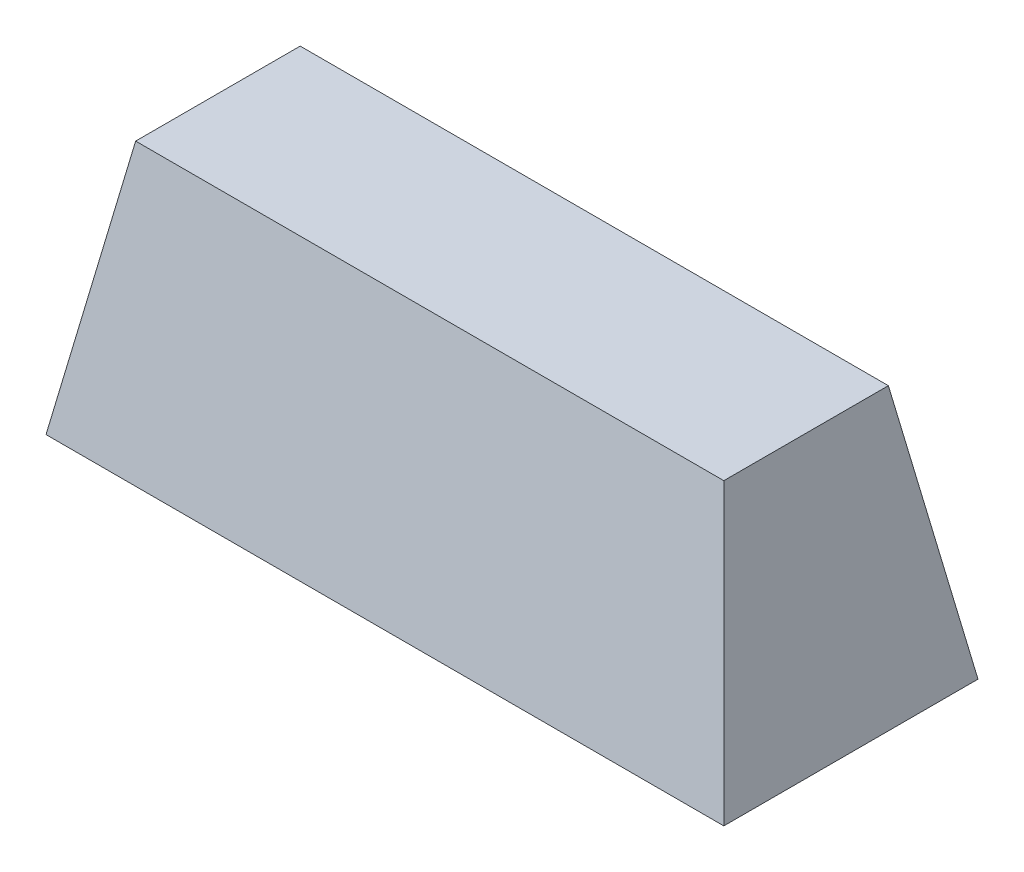
ISO-10303-21;
HEADER;
FILE_DESCRIPTION(('STEP AP214'),'2;1');
FILE_NAME('part.step','',(''),(''),'','','');
FILE_SCHEMA(('AUTOMOTIVE_DESIGN { 1 0 10303 214 1 1 1 1 }'));
ENDSEC;
DATA;
#1=APPLICATION_CONTEXT('core data for automotive mechanical design processes');
#2=APPLICATION_PROTOCOL_DEFINITION('international standard','automotive_design',2000,#1);
#3=PRODUCT_CONTEXT('',#1,'mechanical');
#4=PRODUCT('Part','Part','',(#3));
#5=PRODUCT_RELATED_PRODUCT_CATEGORY('part','',(#4));
#6=PRODUCT_DEFINITION_FORMATION('','',#4);
#7=PRODUCT_DEFINITION_CONTEXT('part definition',#1,'design');
#8=PRODUCT_DEFINITION('design','',#6,#7);
#9=PRODUCT_DEFINITION_SHAPE('','',#8);
#10=(LENGTH_UNIT() NAMED_UNIT(*) SI_UNIT(.MILLI.,.METRE.));
#11=(NAMED_UNIT(*) PLANE_ANGLE_UNIT() SI_UNIT($,.RADIAN.));
#12=(NAMED_UNIT(*) SI_UNIT($,.STERADIAN.) SOLID_ANGLE_UNIT());
#13=UNCERTAINTY_MEASURE_WITH_UNIT(LENGTH_MEASURE(1.E-05),#10,'distance_accuracy_value','');
#14=(GEOMETRIC_REPRESENTATION_CONTEXT(3) GLOBAL_UNCERTAINTY_ASSIGNED_CONTEXT((#13)) GLOBAL_UNIT_ASSIGNED_CONTEXT((#10,
#11,#12)) REPRESENTATION_CONTEXT('',''));
#15=CARTESIAN_POINT('',(0.,0.,0.));
#16=DIRECTION('',(0.,0.,1.));
#17=DIRECTION('',(1.,0.,0.));
#18=AXIS2_PLACEMENT_3D('',#15,#16,#17);
#19=CARTESIAN_POINT('',(-100.,0.,-37.5));
#20=DIRECTION('',(-0.984807753012208,0.17364817766693,0.));
#21=DIRECTION('',(-0.17364817766693,-0.984807753012208,0.));
#22=AXIS2_PLACEMENT_3D('',#19,#20,#21);
#23=PLANE('',#22);
#24=DIRECTION('',(0.,0.,1.));
#25=VECTOR('',#24,1.);
#26=CARTESIAN_POINT('',(-100.,0.,-37.5));
#27=LINE('',#26,#25);
#28=CARTESIAN_POINT('',(-100.,0.,-37.5));
#29=VERTEX_POINT('',#28);
#30=CARTESIAN_POINT('',(-100.,0.,37.5));
#31=VERTEX_POINT('',#30);
#32=EDGE_CURVE('E79',#29,#31,#27,.T.);
#33=ORIENTED_EDGE('',*,*,#32,.T.);
#34=DIRECTION('',(-0.171087869746036,-0.970287525247814,0.171087869746036));
#35=VECTOR('',#34,1.);
#36=CARTESIAN_POINT('',(-94.1457881651527,33.2008851471602,31.6457881651527));
#37=LINE('',#36,#35);
#38=CARTESIAN_POINT('',(-86.7754764468652,75.,24.2754764468652));
#39=VERTEX_POINT('',#38);
#40=EDGE_CURVE('E11',#39,#31,#37,.T.);
#41=ORIENTED_EDGE('',*,*,#40,.F.);
#42=DIRECTION('',(0.,0.,-1.));
#43=VECTOR('',#42,1.);
#44=CARTESIAN_POINT('',(-86.7754764468652,75.,0.));
#45=LINE('',#44,#43);
#46=CARTESIAN_POINT('',(-86.7754764468652,75.,-24.2754764468651));
#47=VERTEX_POINT('',#46);
#48=EDGE_CURVE('E95',#47,#39,#45,.F.);
#49=ORIENTED_EDGE('',*,*,#48,.F.);
#50=DIRECTION('',(-0.171087869746036,-0.970287525247814,-0.171087869746035));
#51=VECTOR('',#50,1.);
#52=CARTESIAN_POINT('',(-100.,0.,-37.5));
#53=LINE('',#52,#51);
#54=EDGE_CURVE('E90',#47,#29,#53,.T.);
#55=ORIENTED_EDGE('',*,*,#54,.T.);
#56=EDGE_LOOP('',(#33,#41,#49,#55));
#57=FACE_BOUND('',#56,.T.);
#58=ADVANCED_FACE('F33',(#57),#23,.T.);
#59=CARTESIAN_POINT('',(100.,0.,37.5));
#60=DIRECTION('',(0.,0.17364817766693,0.984807753012208));
#61=DIRECTION('',(0.,-0.984807753012208,0.17364817766693));
#62=AXIS2_PLACEMENT_3D('',#59,#60,#61);
#63=PLANE('',#62);
#64=DIRECTION('',(1.,0.,0.));
#65=VECTOR('',#64,1.);
#66=CARTESIAN_POINT('',(100.,0.,37.5));
#67=LINE('',#66,#65);
#68=CARTESIAN_POINT('',(100.,0.,37.5));
#69=VERTEX_POINT('',#68);
#70=EDGE_CURVE('E75',#31,#69,#67,.T.);
#71=ORIENTED_EDGE('',*,*,#70,.T.);
#72=DIRECTION('',(0.171087869746036,-0.970287525247814,0.171087869746035));
#73=VECTOR('',#72,1.);
#74=CARTESIAN_POINT('',(97.8046705619322,12.4503319301851,35.3046705619323));
#75=LINE('',#74,#73);
#76=CARTESIAN_POINT('',(86.7754764468651,75.,24.2754764468651));
#77=VERTEX_POINT('',#76);
#78=EDGE_CURVE('E42',#77,#69,#75,.T.);
#79=ORIENTED_EDGE('',*,*,#78,.F.);
#80=DIRECTION('',(-1.,0.,0.));
#81=VECTOR('',#80,1.);
#82=CARTESIAN_POINT('',(0.,75.,24.2754764468651));
#83=LINE('',#82,#81);
#84=EDGE_CURVE('E86',#39,#77,#83,.F.);
#85=ORIENTED_EDGE('',*,*,#84,.F.);
#86=ORIENTED_EDGE('',*,*,#40,.T.);
#87=EDGE_LOOP('',(#71,#79,#85,#86));
#88=FACE_BOUND('',#87,.T.);
#89=ADVANCED_FACE('F35',(#88),#63,.T.);
#90=CARTESIAN_POINT('',(100.,0.,-37.5));
#91=DIRECTION('',(0.984807753012208,0.17364817766693,0.));
#92=DIRECTION('',(-0.17364817766693,0.984807753012208,0.));
#93=AXIS2_PLACEMENT_3D('',#90,#91,#92);
#94=PLANE('',#93);
#95=DIRECTION('',(0.,0.,-1.));
#96=VECTOR('',#95,1.);
#97=CARTESIAN_POINT('',(100.,0.,-37.5));
#98=LINE('',#97,#96);
#99=CARTESIAN_POINT('',(100.,0.,-37.5));
#100=VERTEX_POINT('',#99);
#101=EDGE_CURVE('E80',#69,#100,#98,.T.);
#102=ORIENTED_EDGE('',*,*,#101,.T.);
#103=DIRECTION('',(0.171087869746036,-0.970287525247814,-0.171087869746036));
#104=VECTOR('',#103,1.);
#105=CARTESIAN_POINT('',(100.,0.,-37.5));
#106=LINE('',#105,#104);
#107=CARTESIAN_POINT('',(86.7754764468651,75.,-24.2754764468651));
#108=VERTEX_POINT('',#107);
#109=EDGE_CURVE('E98',#108,#100,#106,.T.);
#110=ORIENTED_EDGE('',*,*,#109,.F.);
#111=DIRECTION('',(0.,0.,1.));
#112=VECTOR('',#111,1.);
#113=CARTESIAN_POINT('',(86.7754764468651,75.,0.));
#114=LINE('',#113,#112);
#115=EDGE_CURVE('E54',#77,#108,#114,.F.);
#116=ORIENTED_EDGE('',*,*,#115,.F.);
#117=ORIENTED_EDGE('',*,*,#78,.T.);
#118=EDGE_LOOP('',(#102,#110,#116,#117));
#119=FACE_BOUND('',#118,.T.);
#120=ADVANCED_FACE('F105',(#119),#94,.T.);
#121=CARTESIAN_POINT('',(100.,0.,-37.5));
#122=DIRECTION('',(0.,0.17364817766693,-0.984807753012208));
#123=DIRECTION('',(0.,0.984807753012208,0.17364817766693));
#124=AXIS2_PLACEMENT_3D('',#121,#122,#123);
#125=PLANE('',#124);
#126=DIRECTION('',(-1.,0.,0.));
#127=VECTOR('',#126,1.);
#128=CARTESIAN_POINT('',(100.,0.,-37.5));
#129=LINE('',#128,#127);
#130=EDGE_CURVE('E94',#100,#29,#129,.T.);
#131=ORIENTED_EDGE('',*,*,#130,.T.);
#132=ORIENTED_EDGE('',*,*,#54,.F.);
#133=DIRECTION('',(1.,0.,0.));
#134=VECTOR('',#133,1.);
#135=CARTESIAN_POINT('',(0.,75.,-24.2754764468651));
#136=LINE('',#135,#134);
#137=EDGE_CURVE('E37',#108,#47,#136,.F.);
#138=ORIENTED_EDGE('',*,*,#137,.F.);
#139=ORIENTED_EDGE('',*,*,#109,.T.);
#140=EDGE_LOOP('',(#131,#132,#138,#139));
#141=FACE_BOUND('',#140,.T.);
#142=ADVANCED_FACE('F107',(#141),#125,.T.);
#143=CARTESIAN_POINT('',(0.,75.,0.));
#144=DIRECTION('',(0.,-1.,0.));
#145=DIRECTION('',(0.,0.,-1.));
#146=AXIS2_PLACEMENT_3D('',#143,#144,#145);
#147=PLANE('',#146);
#148=ORIENTED_EDGE('',*,*,#48,.T.);
#149=ORIENTED_EDGE('',*,*,#84,.T.);
#150=ORIENTED_EDGE('',*,*,#115,.T.);
#151=ORIENTED_EDGE('',*,*,#137,.T.);
#152=EDGE_LOOP('',(#148,#149,#150,#151));
#153=FACE_BOUND('',#152,.T.);
#154=ADVANCED_FACE('F103',(#153),#147,.F.);
#155=CARTESIAN_POINT('',(0.,0.,0.));
#156=DIRECTION('',(0.,-1.,0.));
#157=DIRECTION('',(0.,0.,-1.));
#158=AXIS2_PLACEMENT_3D('',#155,#156,#157);
#159=PLANE('',#158);
#160=ORIENTED_EDGE('',*,*,#32,.F.);
#161=ORIENTED_EDGE('',*,*,#130,.F.);
#162=ORIENTED_EDGE('',*,*,#101,.F.);
#163=ORIENTED_EDGE('',*,*,#70,.F.);
#164=EDGE_LOOP('',(#160,#161,#162,#163));
#165=FACE_BOUND('',#164,.T.);
#166=ADVANCED_FACE('F76',(#165),#159,.T.);
#167=CLOSED_SHELL('',(#58,#89,#120,#142,#154,#166));
#168=MANIFOLD_SOLID_BREP('B2',#167);
#169=ADVANCED_BREP_SHAPE_REPRESENTATION('',(#18,#168),#14);
#170=SHAPE_DEFINITION_REPRESENTATION(#9,#169);
ENDSEC;
END-ISO-10303-21;
